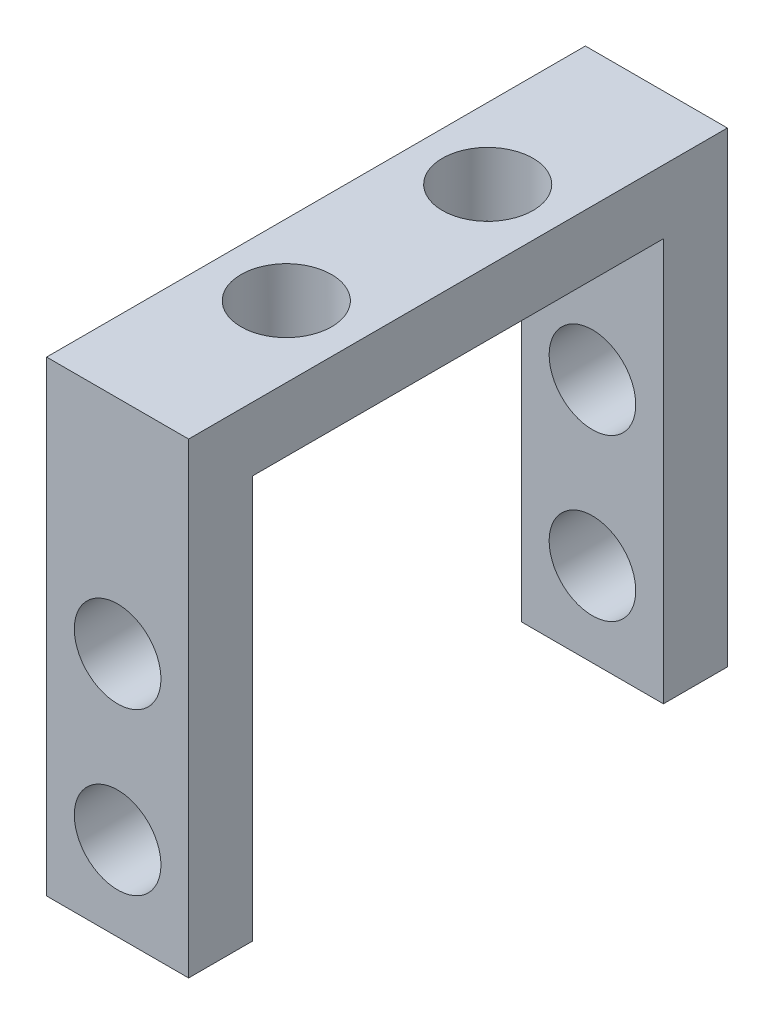
ISO-10303-21;
HEADER;
FILE_DESCRIPTION(('STEP AP214'),'2;1');
FILE_NAME('part.step','',(''),(''),'','','');
FILE_SCHEMA(('AUTOMOTIVE_DESIGN { 1 0 10303 214 1 1 1 1 }'));
ENDSEC;
DATA;
#1=APPLICATION_CONTEXT('core data for automotive mechanical design processes');
#2=APPLICATION_PROTOCOL_DEFINITION('international standard','automotive_design',2000,#1);
#3=PRODUCT_CONTEXT('',#1,'mechanical');
#4=PRODUCT('Part','Part','',(#3));
#5=PRODUCT_RELATED_PRODUCT_CATEGORY('part','',(#4));
#6=PRODUCT_DEFINITION_FORMATION('','',#4);
#7=PRODUCT_DEFINITION_CONTEXT('part definition',#1,'design');
#8=PRODUCT_DEFINITION('design','',#6,#7);
#9=PRODUCT_DEFINITION_SHAPE('','',#8);
#10=(LENGTH_UNIT() NAMED_UNIT(*) SI_UNIT(.MILLI.,.METRE.));
#11=(NAMED_UNIT(*) PLANE_ANGLE_UNIT() SI_UNIT($,.RADIAN.));
#12=(NAMED_UNIT(*) SI_UNIT($,.STERADIAN.) SOLID_ANGLE_UNIT());
#13=UNCERTAINTY_MEASURE_WITH_UNIT(LENGTH_MEASURE(1.E-05),#10,'distance_accuracy_value','');
#14=(GEOMETRIC_REPRESENTATION_CONTEXT(3) GLOBAL_UNCERTAINTY_ASSIGNED_CONTEXT((#13)) GLOBAL_UNIT_ASSIGNED_CONTEXT((#10,
#11,#12)) REPRESENTATION_CONTEXT('',''));
#15=CARTESIAN_POINT('',(0.,0.,0.));
#16=DIRECTION('',(0.,0.,1.));
#17=DIRECTION('',(1.,0.,0.));
#18=AXIS2_PLACEMENT_3D('',#15,#16,#17);
#19=CARTESIAN_POINT('',(0.,0.,0.));
#20=DIRECTION('',(0.,1.,0.));
#21=DIRECTION('',(0.,0.,1.));
#22=AXIS2_PLACEMENT_3D('',#19,#20,#21);
#23=PLANE('',#22);
#24=CARTESIAN_POINT('',(0.,0.,-5.));
#25=DIRECTION('',(0.,1.,0.));
#26=DIRECTION('',(0.,0.,1.));
#27=AXIS2_PLACEMENT_3D('',#24,#25,#26);
#28=CIRCLE('',#27,2.25);
#29=CARTESIAN_POINT('',(0.,0.,-2.75));
#30=VERTEX_POINT('',#29);
#31=EDGE_CURVE('E126',#30,#30,#28,.F.);
#32=ORIENTED_EDGE('',*,*,#31,.F.);
#33=EDGE_LOOP('',(#32));
#34=FACE_BOUND('',#33,.T.);
#35=CARTESIAN_POINT('',(0.,0.,5.00000000000013));
#36=DIRECTION('',(0.,1.,0.));
#37=DIRECTION('',(0.,0.,1.));
#38=AXIS2_PLACEMENT_3D('',#35,#36,#37);
#39=CIRCLE('',#38,2.25);
#40=CARTESIAN_POINT('',(0.,0.,7.25000000000013));
#41=VERTEX_POINT('',#40);
#42=EDGE_CURVE('E129',#41,#41,#39,.F.);
#43=ORIENTED_EDGE('',*,*,#42,.F.);
#44=EDGE_LOOP('',(#43));
#45=FACE_BOUND('',#44,.T.);
#46=DIRECTION('',(1.,0.,0.));
#47=VECTOR('',#46,1.);
#48=CARTESIAN_POINT('',(3.52499999999997,0.,10.2000000000001));
#49=LINE('',#48,#47);
#50=CARTESIAN_POINT('',(-3.52500000000003,0.,10.2000000000001));
#51=VERTEX_POINT('',#50);
#52=CARTESIAN_POINT('',(3.52499999999997,0.,10.2000000000001));
#53=VERTEX_POINT('',#52);
#54=EDGE_CURVE('E124',#51,#53,#49,.T.);
#55=ORIENTED_EDGE('',*,*,#54,.F.);
#56=DIRECTION('',(0.,0.,1.));
#57=VECTOR('',#56,1.);
#58=CARTESIAN_POINT('',(-3.52500000000003,0.,-13.3749999999999));
#59=LINE('',#58,#57);
#60=CARTESIAN_POINT('',(-3.52500000000003,0.,-10.1999999999999));
#61=VERTEX_POINT('',#60);
#62=EDGE_CURVE('E160',#61,#51,#59,.T.);
#63=ORIENTED_EDGE('',*,*,#62,.F.);
#64=DIRECTION('',(-1.,0.,0.));
#65=VECTOR('',#64,1.);
#66=CARTESIAN_POINT('',(3.52499999999997,0.,-10.1999999999999));
#67=LINE('',#66,#65);
#68=CARTESIAN_POINT('',(3.52499999999997,0.,-10.1999999999999));
#69=VERTEX_POINT('',#68);
#70=EDGE_CURVE('E137',#69,#61,#67,.T.);
#71=ORIENTED_EDGE('',*,*,#70,.F.);
#72=DIRECTION('',(0.,0.,-1.));
#73=VECTOR('',#72,1.);
#74=CARTESIAN_POINT('',(3.52499999999997,0.,-13.3749999999999));
#75=LINE('',#74,#73);
#76=EDGE_CURVE('E50',#53,#69,#75,.T.);
#77=ORIENTED_EDGE('',*,*,#76,.F.);
#78=EDGE_LOOP('',(#55,#63,#71,#77));
#79=FACE_BOUND('',#78,.T.);
#80=ADVANCED_FACE('F33',(#34,#45,#79),#23,.F.);
#81=CARTESIAN_POINT('',(3.52499999999997,3.175,-13.3749999999999));
#82=DIRECTION('',(-1.,0.,0.));
#83=DIRECTION('',(0.,0.,1.));
#84=AXIS2_PLACEMENT_3D('',#81,#82,#83);
#85=PLANE('',#84);
#86=DIRECTION('',(0.,-1.,0.));
#87=VECTOR('',#86,1.);
#88=CARTESIAN_POINT('',(3.52499999999996,3.175,13.3750000000001));
#89=LINE('',#88,#87);
#90=CARTESIAN_POINT('',(3.52499999999996,3.175,13.3750000000001));
#91=VERTEX_POINT('',#90);
#92=CARTESIAN_POINT('',(3.52499999999997,-20.,13.3750000000001));
#93=VERTEX_POINT('',#92);
#94=EDGE_CURVE('E109',#91,#93,#89,.T.);
#95=ORIENTED_EDGE('',*,*,#94,.T.);
#96=DIRECTION('',(0.,0.,1.));
#97=VECTOR('',#96,1.);
#98=CARTESIAN_POINT('',(3.52499999999997,-20.,13.3750000000001));
#99=LINE('',#98,#97);
#100=CARTESIAN_POINT('',(3.52499999999997,-20.,10.2000000000001));
#101=VERTEX_POINT('',#100);
#102=EDGE_CURVE('E123',#101,#93,#99,.T.);
#103=ORIENTED_EDGE('',*,*,#102,.F.);
#104=DIRECTION('',(0.,1.,0.));
#105=VECTOR('',#104,1.);
#106=CARTESIAN_POINT('',(3.52499999999997,-20.,10.2000000000001));
#107=LINE('',#106,#105);
#108=EDGE_CURVE('E133',#101,#53,#107,.T.);
#109=ORIENTED_EDGE('',*,*,#108,.T.);
#110=ORIENTED_EDGE('',*,*,#76,.T.);
#111=DIRECTION('',(0.,1.,0.));
#112=VECTOR('',#111,1.);
#113=CARTESIAN_POINT('',(3.52499999999997,-20.,-10.1999999999999));
#114=LINE('',#113,#112);
#115=CARTESIAN_POINT('',(3.52499999999997,-20.,-10.1999999999999));
#116=VERTEX_POINT('',#115);
#117=EDGE_CURVE('E154',#116,#69,#114,.T.);
#118=ORIENTED_EDGE('',*,*,#117,.F.);
#119=DIRECTION('',(0.,0.,1.));
#120=VECTOR('',#119,1.);
#121=CARTESIAN_POINT('',(3.52499999999997,-20.,-13.3749999999999));
#122=LINE('',#121,#120);
#123=CARTESIAN_POINT('',(3.52499999999997,-20.,-13.3749999999999));
#124=VERTEX_POINT('',#123);
#125=EDGE_CURVE('E138',#124,#116,#122,.T.);
#126=ORIENTED_EDGE('',*,*,#125,.F.);
#127=DIRECTION('',(0.,-1.,0.));
#128=VECTOR('',#127,1.);
#129=CARTESIAN_POINT('',(3.52499999999997,3.175,-13.3749999999999));
#130=LINE('',#129,#128);
#131=CARTESIAN_POINT('',(3.52499999999997,3.175,-13.3749999999999));
#132=VERTEX_POINT('',#131);
#133=EDGE_CURVE('E11',#132,#124,#130,.T.);
#134=ORIENTED_EDGE('',*,*,#133,.F.);
#135=DIRECTION('',(0.,0.,-1.));
#136=VECTOR('',#135,1.);
#137=CARTESIAN_POINT('',(3.52499999999997,3.175,-13.3749999999999));
#138=LINE('',#137,#136);
#139=EDGE_CURVE('E157',#91,#132,#138,.T.);
#140=ORIENTED_EDGE('',*,*,#139,.F.);
#141=EDGE_LOOP('',(#95,#103,#109,#110,#118,#126,#134,#140));
#142=FACE_BOUND('',#141,.T.);
#143=ADVANCED_FACE('F35',(#142),#85,.F.);
#144=CARTESIAN_POINT('',(-3.52500000000003,3.175,-13.3749999999999));
#145=DIRECTION('',(0.,0.,1.));
#146=DIRECTION('',(1.,0.,0.));
#147=AXIS2_PLACEMENT_3D('',#144,#145,#146);
#148=PLANE('',#147);
#149=CARTESIAN_POINT('',(0.,-7.825,-13.3749999999999));
#150=DIRECTION('',(0.,0.,-1.));
#151=DIRECTION('',(-1.,0.,0.));
#152=AXIS2_PLACEMENT_3D('',#149,#150,#151);
#153=CIRCLE('',#152,2.15);
#154=CARTESIAN_POINT('',(-2.15,-7.825,-13.3749999999999));
#155=VERTEX_POINT('',#154);
#156=EDGE_CURVE('E177',#155,#155,#153,.T.);
#157=ORIENTED_EDGE('',*,*,#156,.F.);
#158=EDGE_LOOP('',(#157));
#159=FACE_BOUND('',#158,.T.);
#160=CARTESIAN_POINT('',(0.,-15.825,-13.3749999999999));
#161=DIRECTION('',(0.,0.,-1.));
#162=DIRECTION('',(-1.,0.,0.));
#163=AXIS2_PLACEMENT_3D('',#160,#161,#162);
#164=CIRCLE('',#163,2.15);
#165=CARTESIAN_POINT('',(-2.15,-15.825,-13.3749999999999));
#166=VERTEX_POINT('',#165);
#167=EDGE_CURVE('E187',#166,#166,#164,.T.);
#168=ORIENTED_EDGE('',*,*,#167,.F.);
#169=EDGE_LOOP('',(#168));
#170=FACE_BOUND('',#169,.T.);
#171=ORIENTED_EDGE('',*,*,#133,.T.);
#172=DIRECTION('',(1.,0.,0.));
#173=VECTOR('',#172,1.);
#174=CARTESIAN_POINT('',(3.52499999999997,-20.,-13.3749999999999));
#175=LINE('',#174,#173);
#176=CARTESIAN_POINT('',(-3.52500000000003,-20.,-13.3749999999999));
#177=VERTEX_POINT('',#176);
#178=EDGE_CURVE('E146',#177,#124,#175,.T.);
#179=ORIENTED_EDGE('',*,*,#178,.F.);
#180=DIRECTION('',(0.,-1.,0.));
#181=VECTOR('',#180,1.);
#182=CARTESIAN_POINT('',(-3.52500000000003,3.175,-13.3749999999999));
#183=LINE('',#182,#181);
#184=CARTESIAN_POINT('',(-3.52500000000003,3.175,-13.3749999999999));
#185=VERTEX_POINT('',#184);
#186=EDGE_CURVE('E42',#185,#177,#183,.T.);
#187=ORIENTED_EDGE('',*,*,#186,.F.);
#188=DIRECTION('',(-1.,0.,0.));
#189=VECTOR('',#188,1.);
#190=CARTESIAN_POINT('',(-3.52500000000003,3.175,-13.3749999999999));
#191=LINE('',#190,#189);
#192=EDGE_CURVE('E159',#132,#185,#191,.T.);
#193=ORIENTED_EDGE('',*,*,#192,.F.);
#194=EDGE_LOOP('',(#171,#179,#187,#193));
#195=FACE_BOUND('',#194,.T.);
#196=ADVANCED_FACE('F225',(#159,#170,#195),#148,.F.);
#197=CARTESIAN_POINT('',(-3.52500000000003,3.175,-13.3749999999999));
#198=DIRECTION('',(1.,0.,0.));
#199=DIRECTION('',(0.,0.,-1.));
#200=AXIS2_PLACEMENT_3D('',#197,#198,#199);
#201=PLANE('',#200);
#202=ORIENTED_EDGE('',*,*,#186,.T.);
#203=DIRECTION('',(0.,0.,-1.));
#204=VECTOR('',#203,1.);
#205=CARTESIAN_POINT('',(-3.52500000000003,-20.,-13.3749999999999));
#206=LINE('',#205,#204);
#207=CARTESIAN_POINT('',(-3.52500000000003,-20.,-10.1999999999999));
#208=VERTEX_POINT('',#207);
#209=EDGE_CURVE('E143',#208,#177,#206,.T.);
#210=ORIENTED_EDGE('',*,*,#209,.F.);
#211=DIRECTION('',(0.,1.,0.));
#212=VECTOR('',#211,1.);
#213=CARTESIAN_POINT('',(-3.52500000000003,-20.,-10.1999999999999));
#214=LINE('',#213,#212);
#215=EDGE_CURVE('E149',#208,#61,#214,.T.);
#216=ORIENTED_EDGE('',*,*,#215,.T.);
#217=ORIENTED_EDGE('',*,*,#62,.T.);
#218=DIRECTION('',(0.,1.,0.));
#219=VECTOR('',#218,1.);
#220=CARTESIAN_POINT('',(-3.52500000000003,-20.,10.2000000000001));
#221=LINE('',#220,#219);
#222=CARTESIAN_POINT('',(-3.52500000000003,-20.,10.2000000000001));
#223=VERTEX_POINT('',#222);
#224=EDGE_CURVE('E115',#223,#51,#221,.T.);
#225=ORIENTED_EDGE('',*,*,#224,.F.);
#226=DIRECTION('',(0.,0.,-1.));
#227=VECTOR('',#226,1.);
#228=CARTESIAN_POINT('',(-3.52500000000003,-20.,13.3750000000001));
#229=LINE('',#228,#227);
#230=CARTESIAN_POINT('',(-3.52500000000003,-20.,13.3750000000001));
#231=VERTEX_POINT('',#230);
#232=EDGE_CURVE('E112',#231,#223,#229,.T.);
#233=ORIENTED_EDGE('',*,*,#232,.F.);
#234=DIRECTION('',(0.,-1.,0.));
#235=VECTOR('',#234,1.);
#236=CARTESIAN_POINT('',(-3.52500000000001,3.175,13.3750000000001));
#237=LINE('',#236,#235);
#238=CARTESIAN_POINT('',(-3.52500000000001,3.175,13.3750000000001));
#239=VERTEX_POINT('',#238);
#240=EDGE_CURVE('E102',#239,#231,#237,.T.);
#241=ORIENTED_EDGE('',*,*,#240,.F.);
#242=DIRECTION('',(0.,0.,1.));
#243=VECTOR('',#242,1.);
#244=CARTESIAN_POINT('',(-3.52500000000003,3.175,-13.3749999999999));
#245=LINE('',#244,#243);
#246=EDGE_CURVE('E162',#185,#239,#245,.T.);
#247=ORIENTED_EDGE('',*,*,#246,.F.);
#248=EDGE_LOOP('',(#202,#210,#216,#217,#225,#233,#241,#247));
#249=FACE_BOUND('',#248,.T.);
#250=ADVANCED_FACE('F113',(#249),#201,.F.);
#251=CARTESIAN_POINT('',(-3.52500000000001,3.175,13.3750000000001));
#252=DIRECTION('',(0.,0.,-1.));
#253=DIRECTION('',(-1.,0.,0.));
#254=AXIS2_PLACEMENT_3D('',#251,#252,#253);
#255=PLANE('',#254);
#256=CARTESIAN_POINT('',(0.,-7.825,13.3750000000001));
#257=DIRECTION('',(0.,0.,-1.));
#258=DIRECTION('',(-1.,0.,0.));
#259=AXIS2_PLACEMENT_3D('',#256,#257,#258);
#260=CIRCLE('',#259,2.15);
#261=CARTESIAN_POINT('',(-2.15,-7.825,13.3750000000001));
#262=VERTEX_POINT('',#261);
#263=EDGE_CURVE('E171',#262,#262,#260,.T.);
#264=ORIENTED_EDGE('',*,*,#263,.T.);
#265=EDGE_LOOP('',(#264));
#266=FACE_BOUND('',#265,.T.);
#267=CARTESIAN_POINT('',(0.,-15.825,13.3750000000001));
#268=DIRECTION('',(0.,0.,-1.));
#269=DIRECTION('',(-1.,0.,0.));
#270=AXIS2_PLACEMENT_3D('',#267,#268,#269);
#271=CIRCLE('',#270,2.15);
#272=CARTESIAN_POINT('',(-2.15,-15.825,13.3750000000001));
#273=VERTEX_POINT('',#272);
#274=EDGE_CURVE('E182',#273,#273,#271,.T.);
#275=ORIENTED_EDGE('',*,*,#274,.T.);
#276=EDGE_LOOP('',(#275));
#277=FACE_BOUND('',#276,.T.);
#278=ORIENTED_EDGE('',*,*,#240,.T.);
#279=DIRECTION('',(-1.,0.,0.));
#280=VECTOR('',#279,1.);
#281=CARTESIAN_POINT('',(3.52499999999997,-20.,13.3750000000001));
#282=LINE('',#281,#280);
#283=EDGE_CURVE('E106',#93,#231,#282,.T.);
#284=ORIENTED_EDGE('',*,*,#283,.F.);
#285=ORIENTED_EDGE('',*,*,#94,.F.);
#286=DIRECTION('',(1.,0.,0.));
#287=VECTOR('',#286,1.);
#288=CARTESIAN_POINT('',(-3.52500000000001,3.175,13.3750000000001));
#289=LINE('',#288,#287);
#290=EDGE_CURVE('E58',#239,#91,#289,.T.);
#291=ORIENTED_EDGE('',*,*,#290,.F.);
#292=EDGE_LOOP('',(#278,#284,#285,#291));
#293=FACE_BOUND('',#292,.T.);
#294=ADVANCED_FACE('F104',(#266,#277,#293),#255,.F.);
#295=CARTESIAN_POINT('',(0.,3.175,0.));
#296=DIRECTION('',(0.,1.,0.));
#297=DIRECTION('',(0.,0.,1.));
#298=AXIS2_PLACEMENT_3D('',#295,#296,#297);
#299=PLANE('',#298);
#300=CARTESIAN_POINT('',(0.,3.175,-5.));
#301=DIRECTION('',(0.,1.,0.));
#302=DIRECTION('',(0.,0.,1.));
#303=AXIS2_PLACEMENT_3D('',#300,#301,#302);
#304=CIRCLE('',#303,2.25);
#305=CARTESIAN_POINT('',(0.,3.175,-2.75));
#306=VERTEX_POINT('',#305);
#307=EDGE_CURVE('E194',#306,#306,#304,.T.);
#308=ORIENTED_EDGE('',*,*,#307,.F.);
#309=EDGE_LOOP('',(#308));
#310=FACE_BOUND('',#309,.T.);
#311=CARTESIAN_POINT('',(0.,3.175,5.00000000000013));
#312=DIRECTION('',(0.,1.,0.));
#313=DIRECTION('',(0.,0.,-1.));
#314=AXIS2_PLACEMENT_3D('',#311,#312,#313);
#315=CIRCLE('',#314,2.25);
#316=CARTESIAN_POINT('',(0.,3.175,2.75000000000013));
#317=VERTEX_POINT('',#316);
#318=EDGE_CURVE('E193',#317,#317,#315,.T.);
#319=ORIENTED_EDGE('',*,*,#318,.F.);
#320=EDGE_LOOP('',(#319));
#321=FACE_BOUND('',#320,.T.);
#322=ORIENTED_EDGE('',*,*,#139,.T.);
#323=ORIENTED_EDGE('',*,*,#192,.T.);
#324=ORIENTED_EDGE('',*,*,#246,.T.);
#325=ORIENTED_EDGE('',*,*,#290,.T.);
#326=EDGE_LOOP('',(#322,#323,#324,#325));
#327=FACE_BOUND('',#326,.T.);
#328=ADVANCED_FACE('F226',(#310,#321,#327),#299,.T.);
#329=CARTESIAN_POINT('',(3.52499999999997,-20.,-10.1999999999999));
#330=DIRECTION('',(0.,0.,-1.));
#331=DIRECTION('',(-1.,0.,0.));
#332=AXIS2_PLACEMENT_3D('',#329,#330,#331);
#333=PLANE('',#332);
#334=CARTESIAN_POINT('',(0.,-7.825,-10.1999999999999));
#335=DIRECTION('',(0.,0.,-1.));
#336=DIRECTION('',(-1.,0.,0.));
#337=AXIS2_PLACEMENT_3D('',#334,#335,#336);
#338=CIRCLE('',#337,2.15);
#339=CARTESIAN_POINT('',(-2.15,-7.825,-10.1999999999999));
#340=VERTEX_POINT('',#339);
#341=EDGE_CURVE('E190',#340,#340,#338,.T.);
#342=ORIENTED_EDGE('',*,*,#341,.T.);
#343=EDGE_LOOP('',(#342));
#344=FACE_BOUND('',#343,.T.);
#345=CARTESIAN_POINT('',(0.,-15.825,-10.1999999999999));
#346=DIRECTION('',(0.,0.,-1.));
#347=DIRECTION('',(-1.,0.,0.));
#348=AXIS2_PLACEMENT_3D('',#345,#346,#347);
#349=CIRCLE('',#348,2.15);
#350=CARTESIAN_POINT('',(-2.15,-15.825,-10.1999999999999));
#351=VERTEX_POINT('',#350);
#352=EDGE_CURVE('E170',#351,#351,#349,.T.);
#353=ORIENTED_EDGE('',*,*,#352,.T.);
#354=EDGE_LOOP('',(#353));
#355=FACE_BOUND('',#354,.T.);
#356=ORIENTED_EDGE('',*,*,#70,.T.);
#357=ORIENTED_EDGE('',*,*,#215,.F.);
#358=DIRECTION('',(-1.,0.,0.));
#359=VECTOR('',#358,1.);
#360=CARTESIAN_POINT('',(3.52499999999997,-20.,-10.1999999999999));
#361=LINE('',#360,#359);
#362=EDGE_CURVE('E141',#116,#208,#361,.T.);
#363=ORIENTED_EDGE('',*,*,#362,.F.);
#364=ORIENTED_EDGE('',*,*,#117,.T.);
#365=EDGE_LOOP('',(#356,#357,#363,#364));
#366=FACE_BOUND('',#365,.T.);
#367=ADVANCED_FACE('F216',(#344,#355,#366),#333,.F.);
#368=CARTESIAN_POINT('',(0.,-20.,0.));
#369=DIRECTION('',(0.,-1.,0.));
#370=DIRECTION('',(0.,0.,-1.));
#371=AXIS2_PLACEMENT_3D('',#368,#369,#370);
#372=PLANE('',#371);
#373=ORIENTED_EDGE('',*,*,#125,.T.);
#374=ORIENTED_EDGE('',*,*,#362,.T.);
#375=ORIENTED_EDGE('',*,*,#209,.T.);
#376=ORIENTED_EDGE('',*,*,#178,.T.);
#377=EDGE_LOOP('',(#373,#374,#375,#376));
#378=FACE_BOUND('',#377,.T.);
#379=ADVANCED_FACE('F221',(#378),#372,.T.);
#380=CARTESIAN_POINT('',(3.52499999999997,-20.,10.2000000000001));
#381=DIRECTION('',(0.,0.,1.));
#382=DIRECTION('',(1.,0.,0.));
#383=AXIS2_PLACEMENT_3D('',#380,#381,#382);
#384=PLANE('',#383);
#385=CARTESIAN_POINT('',(0.,-7.825,10.2000000000001));
#386=DIRECTION('',(0.,0.,1.));
#387=DIRECTION('',(1.,0.,0.));
#388=AXIS2_PLACEMENT_3D('',#385,#386,#387);
#389=CIRCLE('',#388,2.15);
#390=CARTESIAN_POINT('',(2.15,-7.825,10.2000000000001));
#391=VERTEX_POINT('',#390);
#392=EDGE_CURVE('E37',#391,#391,#389,.T.);
#393=ORIENTED_EDGE('',*,*,#392,.T.);
#394=EDGE_LOOP('',(#393));
#395=FACE_BOUND('',#394,.T.);
#396=CARTESIAN_POINT('',(0.,-15.825,10.2000000000001));
#397=DIRECTION('',(0.,0.,1.));
#398=DIRECTION('',(1.,0.,0.));
#399=AXIS2_PLACEMENT_3D('',#396,#397,#398);
#400=CIRCLE('',#399,2.15);
#401=CARTESIAN_POINT('',(2.15,-15.825,10.2000000000001));
#402=VERTEX_POINT('',#401);
#403=EDGE_CURVE('E168',#402,#402,#400,.T.);
#404=ORIENTED_EDGE('',*,*,#403,.T.);
#405=EDGE_LOOP('',(#404));
#406=FACE_BOUND('',#405,.T.);
#407=ORIENTED_EDGE('',*,*,#54,.T.);
#408=ORIENTED_EDGE('',*,*,#108,.F.);
#409=DIRECTION('',(1.,0.,0.));
#410=VECTOR('',#409,1.);
#411=CARTESIAN_POINT('',(3.52499999999997,-20.,10.2000000000001));
#412=LINE('',#411,#410);
#413=EDGE_CURVE('E118',#223,#101,#412,.T.);
#414=ORIENTED_EDGE('',*,*,#413,.F.);
#415=ORIENTED_EDGE('',*,*,#224,.T.);
#416=EDGE_LOOP('',(#407,#408,#414,#415));
#417=FACE_BOUND('',#416,.T.);
#418=ADVANCED_FACE('F227',(#395,#406,#417),#384,.F.);
#419=CARTESIAN_POINT('',(0.,-20.,0.));
#420=DIRECTION('',(0.,-1.,0.));
#421=DIRECTION('',(0.,0.,-1.));
#422=AXIS2_PLACEMENT_3D('',#419,#420,#421);
#423=PLANE('',#422);
#424=ORIENTED_EDGE('',*,*,#283,.T.);
#425=ORIENTED_EDGE('',*,*,#232,.T.);
#426=ORIENTED_EDGE('',*,*,#413,.T.);
#427=ORIENTED_EDGE('',*,*,#102,.T.);
#428=EDGE_LOOP('',(#424,#425,#426,#427));
#429=FACE_BOUND('',#428,.T.);
#430=ADVANCED_FACE('F121',(#429),#423,.T.);
#431=CARTESIAN_POINT('',(0.,-6.36396103067893,5.00000000000013));
#432=DIRECTION('',(0.,1.,0.));
#433=DIRECTION('',(0.,0.,1.));
#434=AXIS2_PLACEMENT_3D('',#431,#432,#433);
#435=CYLINDRICAL_SURFACE('',#434,2.25);
#436=ORIENTED_EDGE('',*,*,#42,.T.);
#437=EDGE_LOOP('',(#436));
#438=FACE_BOUND('',#437,.T.);
#439=ORIENTED_EDGE('',*,*,#318,.T.);
#440=EDGE_LOOP('',(#439));
#441=FACE_BOUND('',#440,.T.);
#442=ADVANCED_FACE('F204',(#438,#441),#435,.F.);
#443=CARTESIAN_POINT('',(0.,-6.36396103067893,-5.));
#444=DIRECTION('',(0.,1.,0.));
#445=DIRECTION('',(0.,0.,1.));
#446=AXIS2_PLACEMENT_3D('',#443,#444,#445);
#447=CYLINDRICAL_SURFACE('',#446,2.25);
#448=ORIENTED_EDGE('',*,*,#31,.T.);
#449=EDGE_LOOP('',(#448));
#450=FACE_BOUND('',#449,.T.);
#451=ORIENTED_EDGE('',*,*,#307,.T.);
#452=EDGE_LOOP('',(#451));
#453=FACE_BOUND('',#452,.T.);
#454=ADVANCED_FACE('F276',(#450,#453),#447,.F.);
#455=CARTESIAN_POINT('',(0.,-15.825,13.3750000000001));
#456=DIRECTION('',(0.,0.,-1.));
#457=DIRECTION('',(-1.,0.,0.));
#458=AXIS2_PLACEMENT_3D('',#455,#456,#457);
#459=CYLINDRICAL_SURFACE('',#458,2.15);
#460=ORIENTED_EDGE('',*,*,#274,.F.);
#461=EDGE_LOOP('',(#460));
#462=FACE_BOUND('',#461,.T.);
#463=ORIENTED_EDGE('',*,*,#403,.F.);
#464=EDGE_LOOP('',(#463));
#465=FACE_BOUND('',#464,.T.);
#466=ADVANCED_FACE('F264',(#462,#465),#459,.F.);
#467=CARTESIAN_POINT('',(0.,-7.825,13.3750000000001));
#468=DIRECTION('',(0.,0.,-1.));
#469=DIRECTION('',(-1.,0.,0.));
#470=AXIS2_PLACEMENT_3D('',#467,#468,#469);
#471=CYLINDRICAL_SURFACE('',#470,2.15);
#472=ORIENTED_EDGE('',*,*,#263,.F.);
#473=EDGE_LOOP('',(#472));
#474=FACE_BOUND('',#473,.T.);
#475=ORIENTED_EDGE('',*,*,#392,.F.);
#476=EDGE_LOOP('',(#475));
#477=FACE_BOUND('',#476,.T.);
#478=ADVANCED_FACE('F262',(#474,#477),#471,.F.);
#479=ORIENTED_EDGE('',*,*,#167,.T.);
#480=EDGE_LOOP('',(#479));
#481=FACE_BOUND('',#480,.T.);
#482=ORIENTED_EDGE('',*,*,#352,.F.);
#483=EDGE_LOOP('',(#482));
#484=FACE_BOUND('',#483,.T.);
#485=ADVANCED_FACE('F258',(#481,#484),#459,.F.);
#486=ORIENTED_EDGE('',*,*,#156,.T.);
#487=EDGE_LOOP('',(#486));
#488=FACE_BOUND('',#487,.T.);
#489=ORIENTED_EDGE('',*,*,#341,.F.);
#490=EDGE_LOOP('',(#489));
#491=FACE_BOUND('',#490,.T.);
#492=ADVANCED_FACE('F261',(#488,#491),#471,.F.);
#493=CLOSED_SHELL('',(#80,#143,#196,#250,#294,#328,#367,#379,#418,#430,#442,#454,#466,#478,#485,#492));
#494=MANIFOLD_SOLID_BREP('B2',#493);
#495=ADVANCED_BREP_SHAPE_REPRESENTATION('',(#18,#494),#14);
#496=SHAPE_DEFINITION_REPRESENTATION(#9,#495);
ENDSEC;
END-ISO-10303-21;
